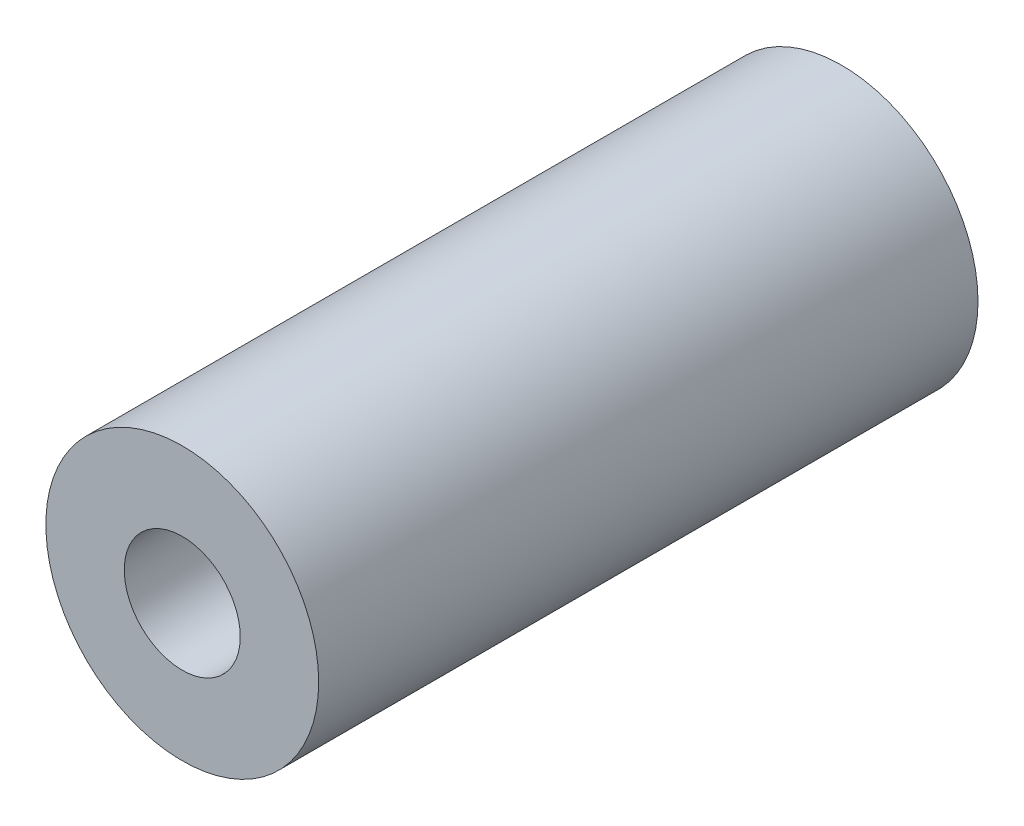
ISO-10303-21;
HEADER;
FILE_DESCRIPTION(('STEP AP214'),'2;1');
FILE_NAME('part.step','',(''),(''),'','','');
FILE_SCHEMA(('AUTOMOTIVE_DESIGN { 1 0 10303 214 1 1 1 1 }'));
ENDSEC;
DATA;
#1=APPLICATION_CONTEXT('core data for automotive mechanical design processes');
#2=APPLICATION_PROTOCOL_DEFINITION('international standard','automotive_design',2000,#1);
#3=PRODUCT_CONTEXT('',#1,'mechanical');
#4=PRODUCT('Part','Part','',(#3));
#5=PRODUCT_RELATED_PRODUCT_CATEGORY('part','',(#4));
#6=PRODUCT_DEFINITION_FORMATION('','',#4);
#7=PRODUCT_DEFINITION_CONTEXT('part definition',#1,'design');
#8=PRODUCT_DEFINITION('design','',#6,#7);
#9=PRODUCT_DEFINITION_SHAPE('','',#8);
#10=(LENGTH_UNIT() NAMED_UNIT(*) SI_UNIT(.MILLI.,.METRE.));
#11=(NAMED_UNIT(*) PLANE_ANGLE_UNIT() SI_UNIT($,.RADIAN.));
#12=(NAMED_UNIT(*) SI_UNIT($,.STERADIAN.) SOLID_ANGLE_UNIT());
#13=UNCERTAINTY_MEASURE_WITH_UNIT(LENGTH_MEASURE(1.E-05),#10,'distance_accuracy_value','');
#14=(GEOMETRIC_REPRESENTATION_CONTEXT(3) GLOBAL_UNCERTAINTY_ASSIGNED_CONTEXT((#13)) GLOBAL_UNIT_ASSIGNED_CONTEXT((#10,
#11,#12)) REPRESENTATION_CONTEXT('',''));
#15=CARTESIAN_POINT('',(0.,0.,0.));
#16=DIRECTION('',(0.,0.,1.));
#17=DIRECTION('',(1.,0.,0.));
#18=AXIS2_PLACEMENT_3D('',#15,#16,#17);
#19=CARTESIAN_POINT('',(-69.2240235522653,-6.18745207944441,56.));
#20=DIRECTION('',(0.,0.,1.));
#21=DIRECTION('',(1.,0.,0.));
#22=AXIS2_PLACEMENT_3D('',#19,#20,#21);
#23=CYLINDRICAL_SURFACE('',#22,6.);
#24=CARTESIAN_POINT('',(-69.2240235522653,-6.18745207944441,56.));
#25=DIRECTION('',(0.,0.,1.));
#26=DIRECTION('',(1.,0.,0.));
#27=AXIS2_PLACEMENT_3D('',#24,#25,#26);
#28=CIRCLE('',#27,6.);
#29=CARTESIAN_POINT('',(-63.2240235522653,-6.18745207944441,56.));
#30=VERTEX_POINT('',#29);
#31=EDGE_CURVE('E10',#30,#30,#28,.T.);
#32=ORIENTED_EDGE('',*,*,#31,.T.);
#33=EDGE_LOOP('',(#32));
#34=FACE_BOUND('',#33,.T.);
#35=CARTESIAN_POINT('',(-69.2240235522653,-6.18745207944441,85.));
#36=DIRECTION('',(0.,0.,1.));
#37=DIRECTION('',(1.,0.,0.));
#38=AXIS2_PLACEMENT_3D('',#35,#36,#37);
#39=CIRCLE('',#38,6.);
#40=CARTESIAN_POINT('',(-63.2240235522653,-6.18745207944441,85.));
#41=VERTEX_POINT('',#40);
#42=EDGE_CURVE('E34',#41,#41,#39,.T.);
#43=ORIENTED_EDGE('',*,*,#42,.F.);
#44=EDGE_LOOP('',(#43));
#45=FACE_BOUND('',#44,.T.);
#46=ADVANCED_FACE('F31',(#34,#45),#23,.T.);
#47=CARTESIAN_POINT('',(-69.2240235522653,-6.18745207944441,56.));
#48=DIRECTION('',(0.,0.,1.));
#49=DIRECTION('',(1.,0.,0.));
#50=AXIS2_PLACEMENT_3D('',#47,#48,#49);
#51=PLANE('',#50);
#52=CARTESIAN_POINT('',(-69.2240235522653,-6.18745207944441,56.));
#53=DIRECTION('',(0.,0.,1.));
#54=DIRECTION('',(1.,0.,0.));
#55=AXIS2_PLACEMENT_3D('',#52,#53,#54);
#56=CIRCLE('',#55,2.54999999999999);
#57=CARTESIAN_POINT('',(-66.6740235522653,-6.18745207944441,56.));
#58=VERTEX_POINT('',#57);
#59=EDGE_CURVE('E41',#58,#58,#56,.T.);
#60=ORIENTED_EDGE('',*,*,#59,.T.);
#61=EDGE_LOOP('',(#60));
#62=FACE_BOUND('',#61,.T.);
#63=ORIENTED_EDGE('',*,*,#31,.F.);
#64=EDGE_LOOP('',(#63));
#65=FACE_BOUND('',#64,.T.);
#66=ADVANCED_FACE('F49',(#62,#65),#51,.F.);
#67=CARTESIAN_POINT('',(-69.2240235522653,-6.18745207944441,85.));
#68=DIRECTION('',(0.,0.,1.));
#69=DIRECTION('',(1.,0.,0.));
#70=AXIS2_PLACEMENT_3D('',#67,#68,#69);
#71=PLANE('',#70);
#72=CARTESIAN_POINT('',(-69.2240235522653,-6.18745207944441,85.));
#73=DIRECTION('',(0.,0.,1.));
#74=DIRECTION('',(1.,0.,0.));
#75=AXIS2_PLACEMENT_3D('',#72,#73,#74);
#76=CIRCLE('',#75,2.54999999999999);
#77=CARTESIAN_POINT('',(-66.6740235522653,-6.18745207944441,85.));
#78=VERTEX_POINT('',#77);
#79=EDGE_CURVE('E43',#78,#78,#76,.T.);
#80=ORIENTED_EDGE('',*,*,#79,.F.);
#81=EDGE_LOOP('',(#80));
#82=FACE_BOUND('',#81,.T.);
#83=ORIENTED_EDGE('',*,*,#42,.T.);
#84=EDGE_LOOP('',(#83));
#85=FACE_BOUND('',#84,.T.);
#86=ADVANCED_FACE('F55',(#82,#85),#71,.T.);
#87=CARTESIAN_POINT('',(-69.2240235522653,-6.18745207944441,56.));
#88=DIRECTION('',(0.,0.,1.));
#89=DIRECTION('',(1.,0.,0.));
#90=AXIS2_PLACEMENT_3D('',#87,#88,#89);
#91=CYLINDRICAL_SURFACE('',#90,2.54999999999999);
#92=ORIENTED_EDGE('',*,*,#59,.F.);
#93=EDGE_LOOP('',(#92));
#94=FACE_BOUND('',#93,.T.);
#95=ORIENTED_EDGE('',*,*,#79,.T.);
#96=EDGE_LOOP('',(#95));
#97=FACE_BOUND('',#96,.T.);
#98=ADVANCED_FACE('F52',(#94,#97),#91,.F.);
#99=CLOSED_SHELL('',(#46,#66,#86,#98));
#100=MANIFOLD_SOLID_BREP('B2',#99);
#101=ADVANCED_BREP_SHAPE_REPRESENTATION('',(#18,#100),#14);
#102=SHAPE_DEFINITION_REPRESENTATION(#9,#101);
ENDSEC;
END-ISO-10303-21;
